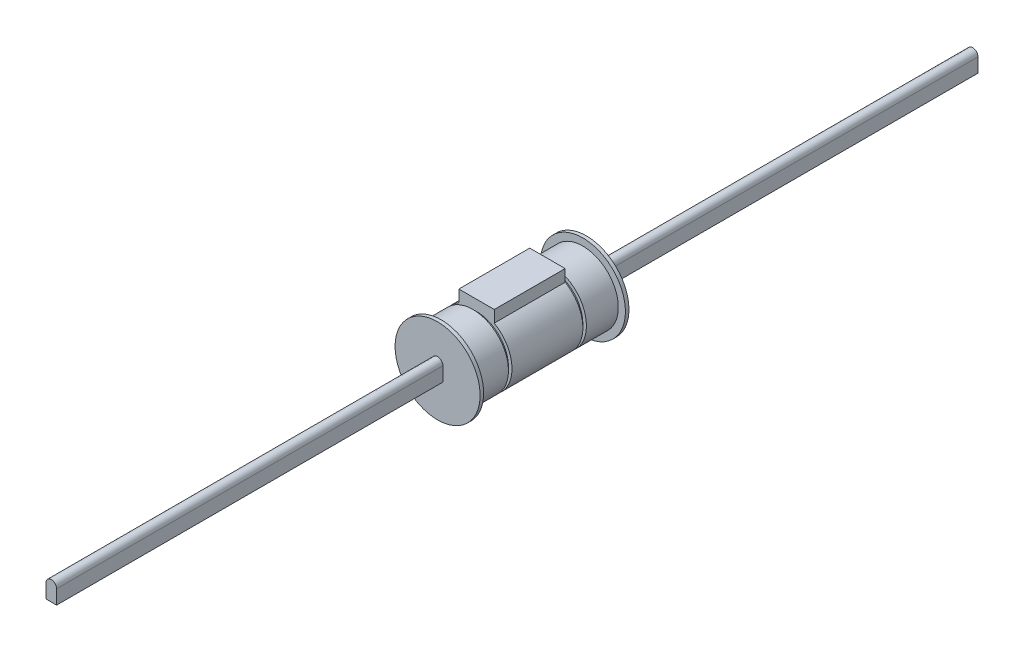
ISO-10303-21;
HEADER;
FILE_DESCRIPTION(('STEP AP214'),'2;1');
FILE_NAME('part.step','',(''),(''),'','','');
FILE_SCHEMA(('AUTOMOTIVE_DESIGN { 1 0 10303 214 1 1 1 1 }'));
ENDSEC;
DATA;
#1=APPLICATION_CONTEXT('core data for automotive mechanical design processes');
#2=APPLICATION_PROTOCOL_DEFINITION('international standard','automotive_design',2000,#1);
#3=PRODUCT_CONTEXT('',#1,'mechanical');
#4=PRODUCT('Part','Part','',(#3));
#5=PRODUCT_RELATED_PRODUCT_CATEGORY('part','',(#4));
#6=PRODUCT_DEFINITION_FORMATION('','',#4);
#7=PRODUCT_DEFINITION_CONTEXT('part definition',#1,'design');
#8=PRODUCT_DEFINITION('design','',#6,#7);
#9=PRODUCT_DEFINITION_SHAPE('','',#8);
#10=(LENGTH_UNIT() NAMED_UNIT(*) SI_UNIT(.MILLI.,.METRE.));
#11=(NAMED_UNIT(*) PLANE_ANGLE_UNIT() SI_UNIT($,.RADIAN.));
#12=(NAMED_UNIT(*) SI_UNIT($,.STERADIAN.) SOLID_ANGLE_UNIT());
#13=UNCERTAINTY_MEASURE_WITH_UNIT(LENGTH_MEASURE(1.E-05),#10,'distance_accuracy_value','');
#14=(GEOMETRIC_REPRESENTATION_CONTEXT(3) GLOBAL_UNCERTAINTY_ASSIGNED_CONTEXT((#13)) GLOBAL_UNIT_ASSIGNED_CONTEXT((#10,
#11,#12)) REPRESENTATION_CONTEXT('',''));
#15=CARTESIAN_POINT('',(0.,0.,0.));
#16=DIRECTION('',(0.,0.,1.));
#17=DIRECTION('',(1.,0.,0.));
#18=AXIS2_PLACEMENT_3D('',#15,#16,#17);
#19=CARTESIAN_POINT('',(0.,0.,60.));
#20=DIRECTION('',(0.,0.,-1.));
#21=DIRECTION('',(-1.,0.,0.));
#22=AXIS2_PLACEMENT_3D('',#19,#20,#21);
#23=CYLINDRICAL_SURFACE('',#22,5.);
#24=CARTESIAN_POINT('',(0.,0.,55.));
#25=DIRECTION('',(0.,0.,-1.));
#26=DIRECTION('',(-1.,0.,0.));
#27=AXIS2_PLACEMENT_3D('',#24,#25,#26);
#28=CIRCLE('',#27,5.);
#29=CARTESIAN_POINT('',(-5.,0.,55.));
#30=VERTEX_POINT('',#29);
#31=EDGE_CURVE('E280',#30,#30,#28,.T.);
#32=ORIENTED_EDGE('',*,*,#31,.F.);
#33=EDGE_LOOP('',(#32));
#34=FACE_BOUND('',#33,.T.);
#35=CARTESIAN_POINT('',(0.,0.,59.5));
#36=DIRECTION('',(0.,0.,1.));
#37=DIRECTION('',(1.,0.,0.));
#38=AXIS2_PLACEMENT_3D('',#35,#36,#37);
#39=CIRCLE('',#38,5.);
#40=CARTESIAN_POINT('',(5.,0.,59.5));
#41=VERTEX_POINT('',#40);
#42=EDGE_CURVE('E316',#41,#41,#39,.T.);
#43=ORIENTED_EDGE('',*,*,#42,.F.);
#44=EDGE_LOOP('',(#43));
#45=FACE_BOUND('',#44,.T.);
#46=ADVANCED_FACE('F65',(#34,#45),#23,.T.);
#47=CARTESIAN_POINT('',(0.,0.,59.5));
#48=DIRECTION('',(0.,0.,1.));
#49=DIRECTION('',(1.,0.,0.));
#50=AXIS2_PLACEMENT_3D('',#47,#48,#49);
#51=PLANE('',#50);
#52=CARTESIAN_POINT('',(0.,0.,59.5));
#53=DIRECTION('',(0.,0.,1.));
#54=DIRECTION('',(1.,0.,0.));
#55=AXIS2_PLACEMENT_3D('',#52,#53,#54);
#56=CIRCLE('',#55,4.5);
#57=CARTESIAN_POINT('',(4.5,0.,59.5));
#58=VERTEX_POINT('',#57);
#59=EDGE_CURVE('E308',#58,#58,#56,.T.);
#60=ORIENTED_EDGE('',*,*,#59,.F.);
#61=EDGE_LOOP('',(#60));
#62=FACE_BOUND('',#61,.T.);
#63=ORIENTED_EDGE('',*,*,#42,.T.);
#64=EDGE_LOOP('',(#63));
#65=FACE_BOUND('',#64,.T.);
#66=ADVANCED_FACE('F364',(#62,#65),#51,.T.);
#67=CARTESIAN_POINT('',(0.,0.,59.5));
#68=DIRECTION('',(0.,0.,1.));
#69=DIRECTION('',(1.,0.,0.));
#70=AXIS2_PLACEMENT_3D('',#67,#68,#69);
#71=CYLINDRICAL_SURFACE('',#70,4.5);
#72=ORIENTED_EDGE('',*,*,#59,.T.);
#73=EDGE_LOOP('',(#72));
#74=FACE_BOUND('',#73,.T.);
#75=CARTESIAN_POINT('',(0.,0.,60.));
#76=DIRECTION('',(0.,0.,1.));
#77=DIRECTION('',(1.,0.,0.));
#78=AXIS2_PLACEMENT_3D('',#75,#76,#77);
#79=CIRCLE('',#78,4.5);
#80=CARTESIAN_POINT('',(4.5,0.,60.));
#81=VERTEX_POINT('',#80);
#82=EDGE_CURVE('E305',#81,#81,#79,.T.);
#83=ORIENTED_EDGE('',*,*,#82,.F.);
#84=EDGE_LOOP('',(#83));
#85=FACE_BOUND('',#84,.T.);
#86=ADVANCED_FACE('F371',(#74,#85),#71,.T.);
#87=CARTESIAN_POINT('',(0.,0.,70.));
#88=DIRECTION('',(0.,0.,1.));
#89=DIRECTION('',(1.,0.,0.));
#90=AXIS2_PLACEMENT_3D('',#87,#88,#89);
#91=PLANE('',#90);
#92=DIRECTION('',(0.,1.,0.));
#93=VECTOR('',#92,1.);
#94=CARTESIAN_POINT('',(-2.5,0.,70.));
#95=LINE('',#94,#93);
#96=CARTESIAN_POINT('',(-2.5,4.33012701892219,70.));
#97=VERTEX_POINT('',#96);
#98=CARTESIAN_POINT('',(-2.5,6.,70.));
#99=VERTEX_POINT('',#98);
#100=EDGE_CURVE('E203',#97,#99,#95,.T.);
#101=ORIENTED_EDGE('',*,*,#100,.F.);
#102=CARTESIAN_POINT('',(0.,0.,70.));
#103=DIRECTION('',(0.,0.,1.));
#104=DIRECTION('',(1.,0.,0.));
#105=AXIS2_PLACEMENT_3D('',#102,#103,#104);
#106=CIRCLE('',#105,5.);
#107=CARTESIAN_POINT('',(2.5,4.33012701892219,70.));
#108=VERTEX_POINT('',#107);
#109=EDGE_CURVE('E297',#97,#108,#106,.T.);
#110=ORIENTED_EDGE('',*,*,#109,.T.);
#111=DIRECTION('',(0.,1.,0.));
#112=VECTOR('',#111,1.);
#113=CARTESIAN_POINT('',(2.5,0.,70.));
#114=LINE('',#113,#112);
#115=CARTESIAN_POINT('',(2.5,6.,70.));
#116=VERTEX_POINT('',#115);
#117=EDGE_CURVE('E196',#108,#116,#114,.T.);
#118=ORIENTED_EDGE('',*,*,#117,.T.);
#119=DIRECTION('',(-1.,0.,0.));
#120=VECTOR('',#119,1.);
#121=CARTESIAN_POINT('',(0.,6.,70.));
#122=LINE('',#121,#120);
#123=EDGE_CURVE('E199',#116,#99,#122,.T.);
#124=ORIENTED_EDGE('',*,*,#123,.T.);
#125=EDGE_LOOP('',(#101,#110,#118,#124));
#126=FACE_BOUND('',#125,.T.);
#127=CARTESIAN_POINT('',(0.,0.,70.));
#128=DIRECTION('',(0.,0.,1.));
#129=DIRECTION('',(1.,0.,0.));
#130=AXIS2_PLACEMENT_3D('',#127,#128,#129);
#131=CIRCLE('',#130,4.5);
#132=CARTESIAN_POINT('',(4.5,0.,70.));
#133=VERTEX_POINT('',#132);
#134=EDGE_CURVE('E292',#133,#133,#131,.T.);
#135=ORIENTED_EDGE('',*,*,#134,.F.);
#136=EDGE_LOOP('',(#135));
#137=FACE_BOUND('',#136,.T.);
#138=ADVANCED_FACE('F377',(#126,#137),#91,.T.);
#139=CARTESIAN_POINT('',(0.,6.,70.));
#140=DIRECTION('',(0.,-1.,0.));
#141=DIRECTION('',(0.,0.,-1.));
#142=AXIS2_PLACEMENT_3D('',#139,#140,#141);
#143=PLANE('',#142);
#144=DIRECTION('',(-1.,0.,0.));
#145=VECTOR('',#144,1.);
#146=CARTESIAN_POINT('',(0.,6.,60.));
#147=LINE('',#146,#145);
#148=CARTESIAN_POINT('',(2.5,6.,60.));
#149=VERTEX_POINT('',#148);
#150=CARTESIAN_POINT('',(-2.5,6.,60.));
#151=VERTEX_POINT('',#150);
#152=EDGE_CURVE('E210',#149,#151,#147,.T.);
#153=ORIENTED_EDGE('',*,*,#152,.T.);
#154=DIRECTION('',(0.,0.,-1.));
#155=VECTOR('',#154,1.);
#156=CARTESIAN_POINT('',(-2.5,6.,70.));
#157=LINE('',#156,#155);
#158=EDGE_CURVE('E220',#99,#151,#157,.T.);
#159=ORIENTED_EDGE('',*,*,#158,.F.);
#160=ORIENTED_EDGE('',*,*,#123,.F.);
#161=DIRECTION('',(0.,0.,-1.));
#162=VECTOR('',#161,1.);
#163=CARTESIAN_POINT('',(2.5,6.,70.));
#164=LINE('',#163,#162);
#165=EDGE_CURVE('E223',#116,#149,#164,.T.);
#166=ORIENTED_EDGE('',*,*,#165,.T.);
#167=EDGE_LOOP('',(#153,#159,#160,#166));
#168=FACE_BOUND('',#167,.T.);
#169=ADVANCED_FACE('F396',(#168),#143,.F.);
#170=CARTESIAN_POINT('',(-2.5,0.,70.));
#171=DIRECTION('',(-1.,0.,0.));
#172=DIRECTION('',(0.,0.,1.));
#173=AXIS2_PLACEMENT_3D('',#170,#171,#172);
#174=PLANE('',#173);
#175=DIRECTION('',(0.,1.,0.));
#176=VECTOR('',#175,1.);
#177=CARTESIAN_POINT('',(-2.5,0.,60.));
#178=LINE('',#177,#176);
#179=CARTESIAN_POINT('',(-2.5,4.33012701892219,60.));
#180=VERTEX_POINT('',#179);
#181=EDGE_CURVE('E200',#180,#151,#178,.T.);
#182=ORIENTED_EDGE('',*,*,#181,.F.);
#183=DIRECTION('',(0.,0.,-1.));
#184=VECTOR('',#183,1.);
#185=CARTESIAN_POINT('',(-2.5,4.33012701892219,70.));
#186=LINE('',#185,#184);
#187=EDGE_CURVE('E207',#97,#180,#186,.T.);
#188=ORIENTED_EDGE('',*,*,#187,.F.);
#189=ORIENTED_EDGE('',*,*,#100,.T.);
#190=ORIENTED_EDGE('',*,*,#158,.T.);
#191=EDGE_LOOP('',(#182,#188,#189,#190));
#192=FACE_BOUND('',#191,.T.);
#193=ADVANCED_FACE('F404',(#192),#174,.T.);
#194=DIRECTION('',(0.,0.,-1.));
#195=VECTOR('',#194,1.);
#196=CARTESIAN_POINT('',(2.5,4.33012701892219,70.));
#197=LINE('',#196,#195);
#198=CARTESIAN_POINT('',(2.5,4.33012701892219,60.));
#199=VERTEX_POINT('',#198);
#200=EDGE_CURVE('E227',#108,#199,#197,.T.);
#201=ORIENTED_EDGE('',*,*,#200,.F.);
#202=ORIENTED_EDGE('',*,*,#109,.F.);
#203=ORIENTED_EDGE('',*,*,#187,.T.);
#204=CARTESIAN_POINT('',(0.,0.,60.));
#205=DIRECTION('',(0.,0.,1.));
#206=DIRECTION('',(1.,0.,0.));
#207=AXIS2_PLACEMENT_3D('',#204,#205,#206);
#208=CIRCLE('',#207,5.);
#209=EDGE_CURVE('E312',#180,#199,#208,.T.);
#210=ORIENTED_EDGE('',*,*,#209,.T.);
#211=EDGE_LOOP('',(#201,#202,#203,#210));
#212=FACE_BOUND('',#211,.T.);
#213=ADVANCED_FACE('F366',(#212),#23,.T.);
#214=CARTESIAN_POINT('',(2.5,0.,70.));
#215=DIRECTION('',(-1.,0.,0.));
#216=DIRECTION('',(0.,0.,1.));
#217=AXIS2_PLACEMENT_3D('',#214,#215,#216);
#218=PLANE('',#217);
#219=DIRECTION('',(0.,1.,0.));
#220=VECTOR('',#219,1.);
#221=CARTESIAN_POINT('',(2.5,0.,60.));
#222=LINE('',#221,#220);
#223=EDGE_CURVE('E195',#199,#149,#222,.T.);
#224=ORIENTED_EDGE('',*,*,#223,.T.);
#225=ORIENTED_EDGE('',*,*,#165,.F.);
#226=ORIENTED_EDGE('',*,*,#117,.F.);
#227=ORIENTED_EDGE('',*,*,#200,.T.);
#228=EDGE_LOOP('',(#224,#225,#226,#227));
#229=FACE_BOUND('',#228,.T.);
#230=ADVANCED_FACE('F402',(#229),#218,.F.);
#231=CARTESIAN_POINT('',(0.,0.,60.));
#232=DIRECTION('',(0.,0.,1.));
#233=DIRECTION('',(1.,0.,0.));
#234=AXIS2_PLACEMENT_3D('',#231,#232,#233);
#235=PLANE('',#234);
#236=ORIENTED_EDGE('',*,*,#223,.F.);
#237=ORIENTED_EDGE('',*,*,#209,.F.);
#238=ORIENTED_EDGE('',*,*,#181,.T.);
#239=ORIENTED_EDGE('',*,*,#152,.F.);
#240=EDGE_LOOP('',(#236,#237,#238,#239));
#241=FACE_BOUND('',#240,.T.);
#242=ORIENTED_EDGE('',*,*,#82,.T.);
#243=EDGE_LOOP('',(#242));
#244=FACE_BOUND('',#243,.T.);
#245=ADVANCED_FACE('F398',(#241,#244),#235,.F.);
#246=CARTESIAN_POINT('',(0.,0.,70.5));
#247=DIRECTION('',(0.,0.,-1.));
#248=DIRECTION('',(1.,0.,0.));
#249=AXIS2_PLACEMENT_3D('',#246,#247,#248);
#250=PLANE('',#249);
#251=CARTESIAN_POINT('',(0.,0.,70.5));
#252=DIRECTION('',(0.,0.,1.));
#253=DIRECTION('',(1.,0.,0.));
#254=AXIS2_PLACEMENT_3D('',#251,#252,#253);
#255=CIRCLE('',#254,5.);
#256=CARTESIAN_POINT('',(5.,0.,70.5));
#257=VERTEX_POINT('',#256);
#258=EDGE_CURVE('E301',#257,#257,#255,.T.);
#259=ORIENTED_EDGE('',*,*,#258,.F.);
#260=EDGE_LOOP('',(#259));
#261=FACE_BOUND('',#260,.T.);
#262=CARTESIAN_POINT('',(0.,0.,70.5));
#263=DIRECTION('',(0.,0.,1.));
#264=DIRECTION('',(1.,0.,0.));
#265=AXIS2_PLACEMENT_3D('',#262,#263,#264);
#266=CIRCLE('',#265,4.5);
#267=CARTESIAN_POINT('',(4.5,0.,70.5));
#268=VERTEX_POINT('',#267);
#269=EDGE_CURVE('E293',#268,#268,#266,.T.);
#270=ORIENTED_EDGE('',*,*,#269,.T.);
#271=EDGE_LOOP('',(#270));
#272=FACE_BOUND('',#271,.T.);
#273=ADVANCED_FACE('F401',(#261,#272),#250,.T.);
#274=CARTESIAN_POINT('',(0.,0.,70.5));
#275=DIRECTION('',(0.,0.,-1.));
#276=DIRECTION('',(-1.,0.,0.));
#277=AXIS2_PLACEMENT_3D('',#274,#275,#276);
#278=CYLINDRICAL_SURFACE('',#277,4.5);
#279=ORIENTED_EDGE('',*,*,#269,.F.);
#280=EDGE_LOOP('',(#279));
#281=FACE_BOUND('',#280,.T.);
#282=ORIENTED_EDGE('',*,*,#134,.T.);
#283=EDGE_LOOP('',(#282));
#284=FACE_BOUND('',#283,.T.);
#285=ADVANCED_FACE('F457',(#281,#284),#278,.T.);
#286=CARTESIAN_POINT('',(0.,0.,75.));
#287=DIRECTION('',(0.,0.,1.));
#288=DIRECTION('',(1.,0.,0.));
#289=AXIS2_PLACEMENT_3D('',#286,#287,#288);
#290=CIRCLE('',#289,5.);
#291=CARTESIAN_POINT('',(5.,0.,75.));
#292=VERTEX_POINT('',#291);
#293=EDGE_CURVE('E191',#292,#292,#290,.T.);
#294=ORIENTED_EDGE('',*,*,#293,.F.);
#295=EDGE_LOOP('',(#294));
#296=FACE_BOUND('',#295,.T.);
#297=ORIENTED_EDGE('',*,*,#258,.T.);
#298=EDGE_LOOP('',(#297));
#299=FACE_BOUND('',#298,.T.);
#300=ADVANCED_FACE('F367',(#296,#299),#23,.T.);
#301=CARTESIAN_POINT('',(0.,0.,54.5));
#302=DIRECTION('',(0.,0.,-1.));
#303=DIRECTION('',(-1.,0.,0.));
#304=AXIS2_PLACEMENT_3D('',#301,#302,#303);
#305=PLANE('',#304);
#306=CARTESIAN_POINT('',(0.,0.,54.5));
#307=DIRECTION('',(0.,0.,-1.));
#308=DIRECTION('',(-1.,0.,0.));
#309=AXIS2_PLACEMENT_3D('',#306,#307,#308);
#310=CIRCLE('',#309,6.);
#311=CARTESIAN_POINT('',(-6.,0.,54.5));
#312=VERTEX_POINT('',#311);
#313=EDGE_CURVE('E286',#312,#312,#310,.T.);
#314=ORIENTED_EDGE('',*,*,#313,.T.);
#315=EDGE_LOOP('',(#314));
#316=FACE_BOUND('',#315,.T.);
#317=DIRECTION('',(0.,-1.,0.));
#318=VECTOR('',#317,1.);
#319=CARTESIAN_POINT('',(0.75,0.,54.5));
#320=LINE('',#319,#318);
#321=CARTESIAN_POINT('',(0.75,1.,54.5));
#322=VERTEX_POINT('',#321);
#323=CARTESIAN_POINT('',(0.75,-1.,54.5));
#324=VERTEX_POINT('',#323);
#325=EDGE_CURVE('E88',#322,#324,#320,.T.);
#326=ORIENTED_EDGE('',*,*,#325,.F.);
#327=CARTESIAN_POINT('',(0.,1.,54.5));
#328=DIRECTION('',(0.,0.,-1.));
#329=DIRECTION('',(-1.,0.,0.));
#330=AXIS2_PLACEMENT_3D('',#327,#328,#329);
#331=CIRCLE('',#330,0.75);
#332=CARTESIAN_POINT('',(-0.75,1.,54.5));
#333=VERTEX_POINT('',#332);
#334=EDGE_CURVE('E266',#333,#322,#331,.T.);
#335=ORIENTED_EDGE('',*,*,#334,.F.);
#336=DIRECTION('',(0.,-1.,0.));
#337=VECTOR('',#336,1.);
#338=CARTESIAN_POINT('',(-0.75,0.,54.5));
#339=LINE('',#338,#337);
#340=CARTESIAN_POINT('',(-0.75,-1.,54.5));
#341=VERTEX_POINT('',#340);
#342=EDGE_CURVE('E74',#333,#341,#339,.T.);
#343=ORIENTED_EDGE('',*,*,#342,.T.);
#344=DIRECTION('',(1.,0.,0.));
#345=VECTOR('',#344,1.);
#346=CARTESIAN_POINT('',(0.,-1.,54.5));
#347=LINE('',#346,#345);
#348=EDGE_CURVE('E265',#341,#324,#347,.T.);
#349=ORIENTED_EDGE('',*,*,#348,.T.);
#350=EDGE_LOOP('',(#326,#335,#343,#349));
#351=FACE_BOUND('',#350,.T.);
#352=ADVANCED_FACE('F263',(#316,#351),#305,.T.);
#353=CARTESIAN_POINT('',(0.,0.,55.));
#354=DIRECTION('',(0.,0.,-1.));
#355=DIRECTION('',(-1.,0.,0.));
#356=AXIS2_PLACEMENT_3D('',#353,#354,#355);
#357=PLANE('',#356);
#358=CARTESIAN_POINT('',(0.,0.,55.));
#359=DIRECTION('',(0.,0.,-1.));
#360=DIRECTION('',(-1.,0.,0.));
#361=AXIS2_PLACEMENT_3D('',#358,#359,#360);
#362=CIRCLE('',#361,6.);
#363=CARTESIAN_POINT('',(-6.,0.,55.));
#364=VERTEX_POINT('',#363);
#365=EDGE_CURVE('E338',#364,#364,#362,.T.);
#366=ORIENTED_EDGE('',*,*,#365,.F.);
#367=EDGE_LOOP('',(#366));
#368=FACE_BOUND('',#367,.T.);
#369=ORIENTED_EDGE('',*,*,#31,.T.);
#370=EDGE_LOOP('',(#369));
#371=FACE_BOUND('',#370,.T.);
#372=ADVANCED_FACE('F353',(#368,#371),#357,.F.);
#373=CARTESIAN_POINT('',(0.,0.,54.5));
#374=DIRECTION('',(0.,0.,1.));
#375=DIRECTION('',(1.,0.,0.));
#376=AXIS2_PLACEMENT_3D('',#373,#374,#375);
#377=CYLINDRICAL_SURFACE('',#376,6.);
#378=ORIENTED_EDGE('',*,*,#313,.F.);
#379=EDGE_LOOP('',(#378));
#380=FACE_BOUND('',#379,.T.);
#381=ORIENTED_EDGE('',*,*,#365,.T.);
#382=EDGE_LOOP('',(#381));
#383=FACE_BOUND('',#382,.T.);
#384=ADVANCED_FACE('F350',(#380,#383),#377,.T.);
#385=CARTESIAN_POINT('',(0.,0.,0.));
#386=DIRECTION('',(0.,0.,1.));
#387=DIRECTION('',(1.,0.,0.));
#388=AXIS2_PLACEMENT_3D('',#385,#386,#387);
#389=PLANE('',#388);
#390=CARTESIAN_POINT('',(0.,1.,0.));
#391=DIRECTION('',(0.,0.,1.));
#392=DIRECTION('',(1.,0.,0.));
#393=AXIS2_PLACEMENT_3D('',#390,#391,#392);
#394=CIRCLE('',#393,0.75);
#395=CARTESIAN_POINT('',(0.75,1.,0.));
#396=VERTEX_POINT('',#395);
#397=CARTESIAN_POINT('',(-0.75,1.,0.));
#398=VERTEX_POINT('',#397);
#399=EDGE_CURVE('E232',#396,#398,#394,.T.);
#400=ORIENTED_EDGE('',*,*,#399,.F.);
#401=DIRECTION('',(0.,1.,0.));
#402=VECTOR('',#401,1.);
#403=CARTESIAN_POINT('',(0.75,0.,0.));
#404=LINE('',#403,#402);
#405=CARTESIAN_POINT('',(0.75,-1.,0.));
#406=VERTEX_POINT('',#405);
#407=EDGE_CURVE('E250',#406,#396,#404,.T.);
#408=ORIENTED_EDGE('',*,*,#407,.F.);
#409=DIRECTION('',(-1.,0.,0.));
#410=VECTOR('',#409,1.);
#411=CARTESIAN_POINT('',(0.,-1.,0.));
#412=LINE('',#411,#410);
#413=CARTESIAN_POINT('',(-0.75,-1.,0.));
#414=VERTEX_POINT('',#413);
#415=EDGE_CURVE('E246',#406,#414,#412,.T.);
#416=ORIENTED_EDGE('',*,*,#415,.T.);
#417=DIRECTION('',(0.,1.,0.));
#418=VECTOR('',#417,1.);
#419=CARTESIAN_POINT('',(-0.75,0.,0.));
#420=LINE('',#419,#418);
#421=EDGE_CURVE('E231',#414,#398,#420,.T.);
#422=ORIENTED_EDGE('',*,*,#421,.T.);
#423=EDGE_LOOP('',(#400,#408,#416,#422));
#424=FACE_BOUND('',#423,.T.);
#425=ADVANCED_FACE('F275',(#424),#389,.F.);
#426=CARTESIAN_POINT('',(0.75,0.,55.));
#427=DIRECTION('',(-1.,0.,0.));
#428=DIRECTION('',(0.,0.,1.));
#429=AXIS2_PLACEMENT_3D('',#426,#427,#428);
#430=PLANE('',#429);
#431=DIRECTION('',(0.,0.,-1.));
#432=VECTOR('',#431,1.);
#433=CARTESIAN_POINT('',(0.75,1.,55.));
#434=LINE('',#433,#432);
#435=EDGE_CURVE('E240',#322,#396,#434,.T.);
#436=ORIENTED_EDGE('',*,*,#435,.F.);
#437=ORIENTED_EDGE('',*,*,#325,.T.);
#438=DIRECTION('',(0.,0.,-1.));
#439=VECTOR('',#438,1.);
#440=CARTESIAN_POINT('',(0.75,-1.,55.));
#441=LINE('',#440,#439);
#442=EDGE_CURVE('E254',#324,#406,#441,.T.);
#443=ORIENTED_EDGE('',*,*,#442,.T.);
#444=ORIENTED_EDGE('',*,*,#407,.T.);
#445=EDGE_LOOP('',(#436,#437,#443,#444));
#446=FACE_BOUND('',#445,.T.);
#447=ADVANCED_FACE('F418',(#446),#430,.F.);
#448=CARTESIAN_POINT('',(-0.75,0.,55.));
#449=DIRECTION('',(-1.,0.,0.));
#450=DIRECTION('',(0.,0.,1.));
#451=AXIS2_PLACEMENT_3D('',#448,#449,#450);
#452=PLANE('',#451);
#453=ORIENTED_EDGE('',*,*,#342,.F.);
#454=DIRECTION('',(0.,0.,-1.));
#455=VECTOR('',#454,1.);
#456=CARTESIAN_POINT('',(-0.75,1.,55.));
#457=LINE('',#456,#455);
#458=EDGE_CURVE('E236',#333,#398,#457,.T.);
#459=ORIENTED_EDGE('',*,*,#458,.T.);
#460=ORIENTED_EDGE('',*,*,#421,.F.);
#461=DIRECTION('',(0.,0.,-1.));
#462=VECTOR('',#461,1.);
#463=CARTESIAN_POINT('',(-0.75,-1.,55.));
#464=LINE('',#463,#462);
#465=EDGE_CURVE('E237',#341,#414,#464,.T.);
#466=ORIENTED_EDGE('',*,*,#465,.F.);
#467=EDGE_LOOP('',(#453,#459,#460,#466));
#468=FACE_BOUND('',#467,.T.);
#469=ADVANCED_FACE('F67',(#468),#452,.T.);
#470=CARTESIAN_POINT('',(0.,-1.,55.));
#471=DIRECTION('',(0.,-1.,0.));
#472=DIRECTION('',(0.,0.,-1.));
#473=AXIS2_PLACEMENT_3D('',#470,#471,#472);
#474=PLANE('',#473);
#475=ORIENTED_EDGE('',*,*,#348,.F.);
#476=ORIENTED_EDGE('',*,*,#465,.T.);
#477=ORIENTED_EDGE('',*,*,#415,.F.);
#478=ORIENTED_EDGE('',*,*,#442,.F.);
#479=EDGE_LOOP('',(#475,#476,#477,#478));
#480=FACE_BOUND('',#479,.T.);
#481=ADVANCED_FACE('F278',(#480),#474,.T.);
#482=CARTESIAN_POINT('',(0.,1.,55.));
#483=DIRECTION('',(0.,0.,-1.));
#484=DIRECTION('',(-1.,0.,0.));
#485=AXIS2_PLACEMENT_3D('',#482,#483,#484);
#486=CYLINDRICAL_SURFACE('',#485,0.75);
#487=ORIENTED_EDGE('',*,*,#458,.F.);
#488=ORIENTED_EDGE('',*,*,#334,.T.);
#489=ORIENTED_EDGE('',*,*,#435,.T.);
#490=ORIENTED_EDGE('',*,*,#399,.T.);
#491=EDGE_LOOP('',(#487,#488,#489,#490));
#492=FACE_BOUND('',#491,.T.);
#493=ADVANCED_FACE('F271',(#492),#486,.T.);
#494=CARTESIAN_POINT('',(0.,0.,75.5));
#495=DIRECTION('',(0.,0.,1.));
#496=DIRECTION('',(-1.,0.,0.));
#497=AXIS2_PLACEMENT_3D('',#494,#495,#496);
#498=PLANE('',#497);
#499=CARTESIAN_POINT('',(0.,0.,75.5));
#500=DIRECTION('',(0.,0.,-1.));
#501=DIRECTION('',(-1.,0.,0.));
#502=AXIS2_PLACEMENT_3D('',#499,#500,#501);
#503=CIRCLE('',#502,6.);
#504=CARTESIAN_POINT('',(-6.,0.,75.5));
#505=VERTEX_POINT('',#504);
#506=EDGE_CURVE('E170',#505,#505,#503,.T.);
#507=ORIENTED_EDGE('',*,*,#506,.F.);
#508=EDGE_LOOP('',(#507));
#509=FACE_BOUND('',#508,.T.);
#510=DIRECTION('',(-1.,0.,0.));
#511=VECTOR('',#510,1.);
#512=CARTESIAN_POINT('',(0.,-1.,75.5));
#513=LINE('',#512,#511);
#514=CARTESIAN_POINT('',(0.75,-1.,75.5));
#515=VERTEX_POINT('',#514);
#516=CARTESIAN_POINT('',(-0.75,-1.,75.5));
#517=VERTEX_POINT('',#516);
#518=EDGE_CURVE('E169',#515,#517,#513,.T.);
#519=ORIENTED_EDGE('',*,*,#518,.T.);
#520=DIRECTION('',(0.,1.,0.));
#521=VECTOR('',#520,1.);
#522=CARTESIAN_POINT('',(-0.75,0.,75.5));
#523=LINE('',#522,#521);
#524=CARTESIAN_POINT('',(-0.75,1.,75.5));
#525=VERTEX_POINT('',#524);
#526=EDGE_CURVE('E81',#517,#525,#523,.T.);
#527=ORIENTED_EDGE('',*,*,#526,.T.);
#528=CARTESIAN_POINT('',(0.,1.,75.5));
#529=DIRECTION('',(0.,0.,1.));
#530=DIRECTION('',(1.,0.,0.));
#531=AXIS2_PLACEMENT_3D('',#528,#529,#530);
#532=CIRCLE('',#531,0.75);
#533=CARTESIAN_POINT('',(0.75,1.,75.5));
#534=VERTEX_POINT('',#533);
#535=EDGE_CURVE('E12',#534,#525,#532,.T.);
#536=ORIENTED_EDGE('',*,*,#535,.F.);
#537=DIRECTION('',(0.,1.,0.));
#538=VECTOR('',#537,1.);
#539=CARTESIAN_POINT('',(0.75,0.,75.5));
#540=LINE('',#539,#538);
#541=EDGE_CURVE('E154',#515,#534,#540,.T.);
#542=ORIENTED_EDGE('',*,*,#541,.F.);
#543=EDGE_LOOP('',(#519,#527,#536,#542));
#544=FACE_BOUND('',#543,.T.);
#545=ADVANCED_FACE('F153',(#509,#544),#498,.T.);
#546=CARTESIAN_POINT('',(0.,0.,75.5));
#547=DIRECTION('',(0.,0.,-1.));
#548=DIRECTION('',(-1.,0.,0.));
#549=AXIS2_PLACEMENT_3D('',#546,#547,#548);
#550=CYLINDRICAL_SURFACE('',#549,6.);
#551=ORIENTED_EDGE('',*,*,#506,.T.);
#552=EDGE_LOOP('',(#551));
#553=FACE_BOUND('',#552,.T.);
#554=CARTESIAN_POINT('',(0.,0.,75.));
#555=DIRECTION('',(0.,0.,-1.));
#556=DIRECTION('',(-1.,0.,0.));
#557=AXIS2_PLACEMENT_3D('',#554,#555,#556);
#558=CIRCLE('',#557,6.);
#559=CARTESIAN_POINT('',(-6.,0.,75.));
#560=VERTEX_POINT('',#559);
#561=EDGE_CURVE('E606',#560,#560,#558,.T.);
#562=ORIENTED_EDGE('',*,*,#561,.F.);
#563=EDGE_LOOP('',(#562));
#564=FACE_BOUND('',#563,.T.);
#565=ADVANCED_FACE('F585',(#553,#564),#550,.T.);
#566=CARTESIAN_POINT('',(0.,0.,75.));
#567=DIRECTION('',(0.,0.,1.));
#568=DIRECTION('',(-1.,0.,0.));
#569=AXIS2_PLACEMENT_3D('',#566,#567,#568);
#570=PLANE('',#569);
#571=ORIENTED_EDGE('',*,*,#293,.T.);
#572=EDGE_LOOP('',(#571));
#573=FACE_BOUND('',#572,.T.);
#574=ORIENTED_EDGE('',*,*,#561,.T.);
#575=EDGE_LOOP('',(#574));
#576=FACE_BOUND('',#575,.T.);
#577=ADVANCED_FACE('F385',(#573,#576),#570,.F.);
#578=CARTESIAN_POINT('',(0.,0.,130.));
#579=DIRECTION('',(0.,0.,1.));
#580=DIRECTION('',(1.,0.,0.));
#581=AXIS2_PLACEMENT_3D('',#578,#579,#580);
#582=PLANE('',#581);
#583=CARTESIAN_POINT('',(0.,1.,130.));
#584=DIRECTION('',(0.,0.,1.));
#585=DIRECTION('',(1.,0.,0.));
#586=AXIS2_PLACEMENT_3D('',#583,#584,#585);
#587=CIRCLE('',#586,0.75);
#588=CARTESIAN_POINT('',(0.75,1.,130.));
#589=VERTEX_POINT('',#588);
#590=CARTESIAN_POINT('',(-0.75,1.,130.));
#591=VERTEX_POINT('',#590);
#592=EDGE_CURVE('E173',#589,#591,#587,.T.);
#593=ORIENTED_EDGE('',*,*,#592,.T.);
#594=DIRECTION('',(0.,1.,0.));
#595=VECTOR('',#594,1.);
#596=CARTESIAN_POINT('',(-0.75,0.,130.));
#597=LINE('',#596,#595);
#598=CARTESIAN_POINT('',(-0.75,-1.,130.));
#599=VERTEX_POINT('',#598);
#600=EDGE_CURVE('E324',#599,#591,#597,.T.);
#601=ORIENTED_EDGE('',*,*,#600,.F.);
#602=DIRECTION('',(-1.,0.,0.));
#603=VECTOR('',#602,1.);
#604=CARTESIAN_POINT('',(0.,-1.,130.));
#605=LINE('',#604,#603);
#606=CARTESIAN_POINT('',(0.75,-1.,130.));
#607=VERTEX_POINT('',#606);
#608=EDGE_CURVE('E181',#607,#599,#605,.T.);
#609=ORIENTED_EDGE('',*,*,#608,.F.);
#610=DIRECTION('',(0.,1.,0.));
#611=VECTOR('',#610,1.);
#612=CARTESIAN_POINT('',(0.75,0.,130.));
#613=LINE('',#612,#611);
#614=EDGE_CURVE('E175',#607,#589,#613,.T.);
#615=ORIENTED_EDGE('',*,*,#614,.T.);
#616=EDGE_LOOP('',(#593,#601,#609,#615));
#617=FACE_BOUND('',#616,.T.);
#618=ADVANCED_FACE('F334',(#617),#582,.T.);
#619=CARTESIAN_POINT('',(0.,1.,130.));
#620=DIRECTION('',(0.,0.,-1.));
#621=DIRECTION('',(-1.,0.,0.));
#622=AXIS2_PLACEMENT_3D('',#619,#620,#621);
#623=CYLINDRICAL_SURFACE('',#622,0.75);
#624=DIRECTION('',(0.,0.,-1.));
#625=VECTOR('',#624,1.);
#626=CARTESIAN_POINT('',(0.75,1.,130.));
#627=LINE('',#626,#625);
#628=EDGE_CURVE('E165',#589,#534,#627,.T.);
#629=ORIENTED_EDGE('',*,*,#628,.T.);
#630=ORIENTED_EDGE('',*,*,#535,.T.);
#631=DIRECTION('',(0.,0.,-1.));
#632=VECTOR('',#631,1.);
#633=CARTESIAN_POINT('',(-0.75,1.,130.));
#634=LINE('',#633,#632);
#635=EDGE_CURVE('E188',#591,#525,#634,.T.);
#636=ORIENTED_EDGE('',*,*,#635,.F.);
#637=ORIENTED_EDGE('',*,*,#592,.F.);
#638=EDGE_LOOP('',(#629,#630,#636,#637));
#639=FACE_BOUND('',#638,.T.);
#640=ADVANCED_FACE('F172',(#639),#623,.T.);
#641=CARTESIAN_POINT('',(0.75,0.,130.));
#642=DIRECTION('',(-1.,0.,0.));
#643=DIRECTION('',(0.,-1.,0.));
#644=AXIS2_PLACEMENT_3D('',#641,#642,#643);
#645=PLANE('',#644);
#646=DIRECTION('',(0.,0.,-1.));
#647=VECTOR('',#646,1.);
#648=CARTESIAN_POINT('',(0.75,-1.,130.));
#649=LINE('',#648,#647);
#650=EDGE_CURVE('E167',#607,#515,#649,.T.);
#651=ORIENTED_EDGE('',*,*,#650,.T.);
#652=ORIENTED_EDGE('',*,*,#541,.T.);
#653=ORIENTED_EDGE('',*,*,#628,.F.);
#654=ORIENTED_EDGE('',*,*,#614,.F.);
#655=EDGE_LOOP('',(#651,#652,#653,#654));
#656=FACE_BOUND('',#655,.T.);
#657=ADVANCED_FACE('F163',(#656),#645,.F.);
#658=CARTESIAN_POINT('',(0.,-1.,130.));
#659=DIRECTION('',(0.,-1.,0.));
#660=DIRECTION('',(0.,0.,-1.));
#661=AXIS2_PLACEMENT_3D('',#658,#659,#660);
#662=PLANE('',#661);
#663=ORIENTED_EDGE('',*,*,#518,.F.);
#664=ORIENTED_EDGE('',*,*,#650,.F.);
#665=ORIENTED_EDGE('',*,*,#608,.T.);
#666=DIRECTION('',(0.,0.,-1.));
#667=VECTOR('',#666,1.);
#668=CARTESIAN_POINT('',(-0.75,-1.,130.));
#669=LINE('',#668,#667);
#670=EDGE_CURVE('E179',#599,#517,#669,.T.);
#671=ORIENTED_EDGE('',*,*,#670,.T.);
#672=EDGE_LOOP('',(#663,#664,#665,#671));
#673=FACE_BOUND('',#672,.T.);
#674=ADVANCED_FACE('F331',(#673),#662,.T.);
#675=CARTESIAN_POINT('',(-0.75,0.,130.));
#676=DIRECTION('',(-1.,0.,0.));
#677=DIRECTION('',(0.,0.,1.));
#678=AXIS2_PLACEMENT_3D('',#675,#676,#677);
#679=PLANE('',#678);
#680=ORIENTED_EDGE('',*,*,#526,.F.);
#681=ORIENTED_EDGE('',*,*,#670,.F.);
#682=ORIENTED_EDGE('',*,*,#600,.T.);
#683=ORIENTED_EDGE('',*,*,#635,.T.);
#684=EDGE_LOOP('',(#680,#681,#682,#683));
#685=FACE_BOUND('',#684,.T.);
#686=ADVANCED_FACE('F336',(#685),#679,.T.);
#687=CLOSED_SHELL('',(#46,#66,#86,#138,#169,#193,#213,#230,#245,#273,#285,#300,#352,#372,#384,
#425,#447,#469,#481,#493,#545,#565,#577,#618,#640,#657,#674,#686));
#688=MANIFOLD_SOLID_BREP('B2',#687);
#689=ADVANCED_BREP_SHAPE_REPRESENTATION('',(#18,#688),#14);
#690=SHAPE_DEFINITION_REPRESENTATION(#9,#689);
ENDSEC;
END-ISO-10303-21;
